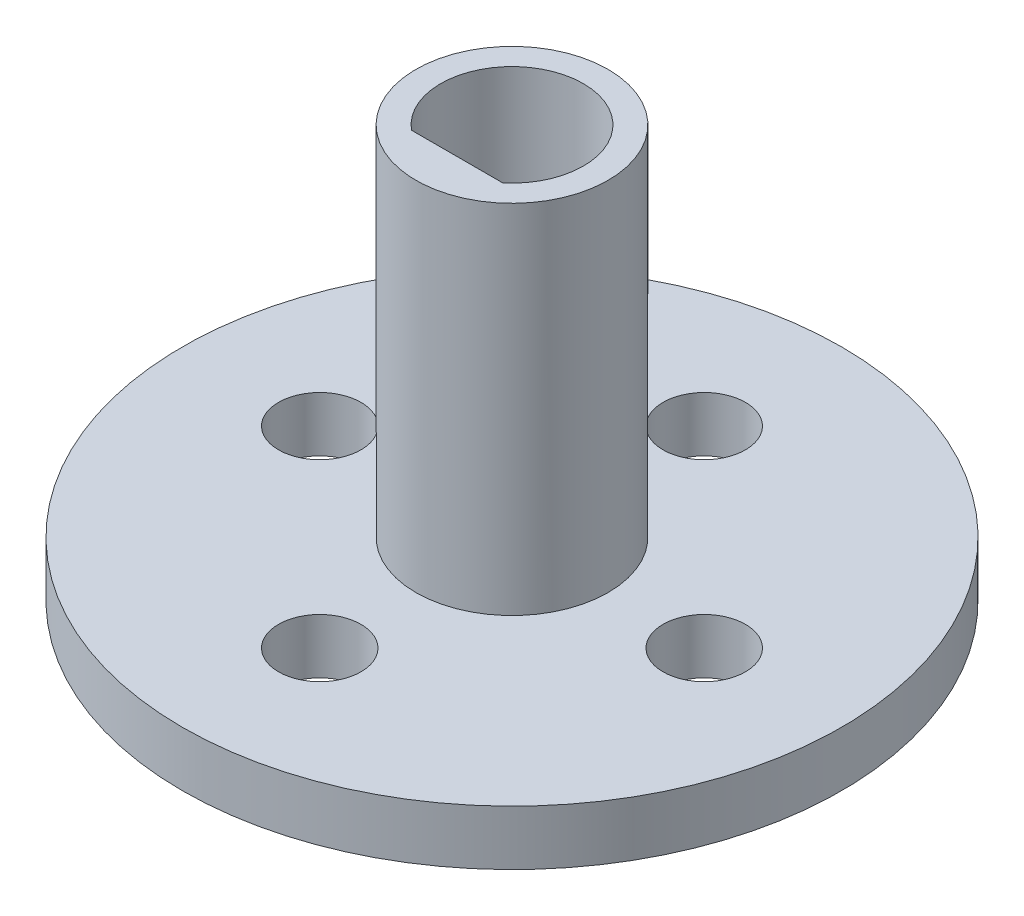
ISO-10303-21;
HEADER;
FILE_DESCRIPTION(('STEP AP214'),'2;1');
FILE_NAME('part.step','',(''),(''),'','','');
FILE_SCHEMA(('AUTOMOTIVE_DESIGN { 1 0 10303 214 1 1 1 1 }'));
ENDSEC;
DATA;
#1=APPLICATION_CONTEXT('core data for automotive mechanical design processes');
#2=APPLICATION_PROTOCOL_DEFINITION('international standard','automotive_design',2000,#1);
#3=PRODUCT_CONTEXT('',#1,'mechanical');
#4=PRODUCT('Part','Part','',(#3));
#5=PRODUCT_RELATED_PRODUCT_CATEGORY('part','',(#4));
#6=PRODUCT_DEFINITION_FORMATION('','',#4);
#7=PRODUCT_DEFINITION_CONTEXT('part definition',#1,'design');
#8=PRODUCT_DEFINITION('design','',#6,#7);
#9=PRODUCT_DEFINITION_SHAPE('','',#8);
#10=(LENGTH_UNIT() NAMED_UNIT(*) SI_UNIT(.MILLI.,.METRE.));
#11=(NAMED_UNIT(*) PLANE_ANGLE_UNIT() SI_UNIT($,.RADIAN.));
#12=(NAMED_UNIT(*) SI_UNIT($,.STERADIAN.) SOLID_ANGLE_UNIT());
#13=UNCERTAINTY_MEASURE_WITH_UNIT(LENGTH_MEASURE(1.E-05),#10,'distance_accuracy_value','');
#14=(GEOMETRIC_REPRESENTATION_CONTEXT(3) GLOBAL_UNCERTAINTY_ASSIGNED_CONTEXT((#13)) GLOBAL_UNIT_ASSIGNED_CONTEXT((#10,
#11,#12)) REPRESENTATION_CONTEXT('',''));
#15=CARTESIAN_POINT('',(0.,0.,0.));
#16=DIRECTION('',(0.,0.,1.));
#17=DIRECTION('',(1.,0.,0.));
#18=AXIS2_PLACEMENT_3D('',#15,#16,#17);
#19=CARTESIAN_POINT('',(0.,2.,0.));
#20=DIRECTION('',(0.,1.,0.));
#21=DIRECTION('',(0.,0.,1.));
#22=AXIS2_PLACEMENT_3D('',#19,#20,#21);
#23=PLANE('',#22);
#24=CARTESIAN_POINT('',(0.,2.,0.));
#25=DIRECTION('',(0.,1.,0.));
#26=DIRECTION('',(0.,0.,1.));
#27=AXIS2_PLACEMENT_3D('',#24,#25,#26);
#28=CIRCLE('',#27,3.5);
#29=CARTESIAN_POINT('',(0.,2.,3.5));
#30=VERTEX_POINT('',#29);
#31=EDGE_CURVE('E11',#30,#30,#28,.T.);
#32=ORIENTED_EDGE('',*,*,#31,.F.);
#33=EDGE_LOOP('',(#32));
#34=FACE_BOUND('',#33,.T.);
#35=CARTESIAN_POINT('',(0.,2.,7.));
#36=DIRECTION('',(0.,1.,0.));
#37=DIRECTION('',(0.,0.,1.));
#38=AXIS2_PLACEMENT_3D('',#35,#36,#37);
#39=CIRCLE('',#38,1.5);
#40=CARTESIAN_POINT('',(0.,2.,8.5));
#41=VERTEX_POINT('',#40);
#42=EDGE_CURVE('E101',#41,#41,#39,.T.);
#43=ORIENTED_EDGE('',*,*,#42,.F.);
#44=EDGE_LOOP('',(#43));
#45=FACE_BOUND('',#44,.T.);
#46=CARTESIAN_POINT('',(0.,2.,-7.));
#47=DIRECTION('',(0.,1.,0.));
#48=DIRECTION('',(0.,0.,1.));
#49=AXIS2_PLACEMENT_3D('',#46,#47,#48);
#50=CIRCLE('',#49,1.5);
#51=CARTESIAN_POINT('',(0.,2.,-5.5));
#52=VERTEX_POINT('',#51);
#53=EDGE_CURVE('E114',#52,#52,#50,.T.);
#54=ORIENTED_EDGE('',*,*,#53,.F.);
#55=EDGE_LOOP('',(#54));
#56=FACE_BOUND('',#55,.T.);
#57=CARTESIAN_POINT('',(0.,2.,0.));
#58=DIRECTION('',(0.,1.,0.));
#59=DIRECTION('',(0.,0.,1.));
#60=AXIS2_PLACEMENT_3D('',#57,#58,#59);
#61=CIRCLE('',#60,12.);
#62=CARTESIAN_POINT('',(0.,2.,12.));
#63=VERTEX_POINT('',#62);
#64=EDGE_CURVE('E55',#63,#63,#61,.T.);
#65=ORIENTED_EDGE('',*,*,#64,.T.);
#66=EDGE_LOOP('',(#65));
#67=FACE_BOUND('',#66,.T.);
#68=CARTESIAN_POINT('',(7.,2.,0.));
#69=DIRECTION('',(0.,1.,0.));
#70=DIRECTION('',(0.,0.,1.));
#71=AXIS2_PLACEMENT_3D('',#68,#69,#70);
#72=CIRCLE('',#71,1.5);
#73=CARTESIAN_POINT('',(7.,2.,1.50000000000002));
#74=VERTEX_POINT('',#73);
#75=EDGE_CURVE('E110',#74,#74,#72,.T.);
#76=ORIENTED_EDGE('',*,*,#75,.F.);
#77=EDGE_LOOP('',(#76));
#78=FACE_BOUND('',#77,.T.);
#79=CARTESIAN_POINT('',(-7.,2.,0.));
#80=DIRECTION('',(0.,1.,0.));
#81=DIRECTION('',(0.,0.,1.));
#82=AXIS2_PLACEMENT_3D('',#79,#80,#81);
#83=CIRCLE('',#82,1.5);
#84=CARTESIAN_POINT('',(-7.,2.,1.49999999999993));
#85=VERTEX_POINT('',#84);
#86=EDGE_CURVE('E92',#85,#85,#83,.T.);
#87=ORIENTED_EDGE('',*,*,#86,.F.);
#88=EDGE_LOOP('',(#87));
#89=FACE_BOUND('',#88,.T.);
#90=ADVANCED_FACE('F43',(#34,#45,#56,#67,#78,#89),#23,.T.);
#91=CARTESIAN_POINT('',(0.,0.,0.));
#92=DIRECTION('',(0.,1.,0.));
#93=DIRECTION('',(0.,0.,1.));
#94=AXIS2_PLACEMENT_3D('',#91,#92,#93);
#95=PLANE('',#94);
#96=DIRECTION('',(1.,0.,0.));
#97=VECTOR('',#96,1.);
#98=CARTESIAN_POINT('',(-1.66132477258361,0.,2.));
#99=LINE('',#98,#97);
#100=CARTESIAN_POINT('',(-1.66132477258361,0.,2.));
#101=VERTEX_POINT('',#100);
#102=CARTESIAN_POINT('',(1.66132477258361,0.,2.));
#103=VERTEX_POINT('',#102);
#104=EDGE_CURVE('E77',#101,#103,#99,.T.);
#105=ORIENTED_EDGE('',*,*,#104,.T.);
#106=CARTESIAN_POINT('',(0.,0.,0.));
#107=DIRECTION('',(0.,1.,0.));
#108=DIRECTION('',(0.,0.,1.));
#109=AXIS2_PLACEMENT_3D('',#106,#107,#108);
#110=CIRCLE('',#109,2.6);
#111=EDGE_CURVE('E73',#103,#101,#110,.T.);
#112=ORIENTED_EDGE('',*,*,#111,.T.);
#113=EDGE_LOOP('',(#105,#112));
#114=FACE_BOUND('',#113,.T.);
#115=CARTESIAN_POINT('',(0.,0.,0.));
#116=DIRECTION('',(0.,1.,0.));
#117=DIRECTION('',(0.,0.,1.));
#118=AXIS2_PLACEMENT_3D('',#115,#116,#117);
#119=CIRCLE('',#118,12.);
#120=CARTESIAN_POINT('',(0.,0.,12.));
#121=VERTEX_POINT('',#120);
#122=EDGE_CURVE('E50',#121,#121,#119,.T.);
#123=ORIENTED_EDGE('',*,*,#122,.F.);
#124=EDGE_LOOP('',(#123));
#125=FACE_BOUND('',#124,.T.);
#126=CARTESIAN_POINT('',(0.,0.,-7.));
#127=DIRECTION('',(0.,1.,0.));
#128=DIRECTION('',(0.,0.,1.));
#129=AXIS2_PLACEMENT_3D('',#126,#127,#128);
#130=CIRCLE('',#129,1.5);
#131=CARTESIAN_POINT('',(0.,0.,-5.5));
#132=VERTEX_POINT('',#131);
#133=EDGE_CURVE('E109',#132,#132,#130,.T.);
#134=ORIENTED_EDGE('',*,*,#133,.T.);
#135=EDGE_LOOP('',(#134));
#136=FACE_BOUND('',#135,.T.);
#137=CARTESIAN_POINT('',(7.,0.,0.));
#138=DIRECTION('',(0.,1.,0.));
#139=DIRECTION('',(0.,0.,1.));
#140=AXIS2_PLACEMENT_3D('',#137,#138,#139);
#141=CIRCLE('',#140,1.5);
#142=CARTESIAN_POINT('',(7.,0.,1.50000000000002));
#143=VERTEX_POINT('',#142);
#144=EDGE_CURVE('E102',#143,#143,#141,.T.);
#145=ORIENTED_EDGE('',*,*,#144,.T.);
#146=EDGE_LOOP('',(#145));
#147=FACE_BOUND('',#146,.T.);
#148=CARTESIAN_POINT('',(0.,0.,7.));
#149=DIRECTION('',(0.,1.,0.));
#150=DIRECTION('',(0.,0.,1.));
#151=AXIS2_PLACEMENT_3D('',#148,#149,#150);
#152=CIRCLE('',#151,1.5);
#153=CARTESIAN_POINT('',(0.,0.,8.5));
#154=VERTEX_POINT('',#153);
#155=EDGE_CURVE('E98',#154,#154,#152,.T.);
#156=ORIENTED_EDGE('',*,*,#155,.T.);
#157=EDGE_LOOP('',(#156));
#158=FACE_BOUND('',#157,.T.);
#159=CARTESIAN_POINT('',(-7.,0.,0.));
#160=DIRECTION('',(0.,1.,0.));
#161=DIRECTION('',(0.,0.,1.));
#162=AXIS2_PLACEMENT_3D('',#159,#160,#161);
#163=CIRCLE('',#162,1.5);
#164=CARTESIAN_POINT('',(-7.,0.,1.49999999999993));
#165=VERTEX_POINT('',#164);
#166=EDGE_CURVE('E91',#165,#165,#163,.T.);
#167=ORIENTED_EDGE('',*,*,#166,.T.);
#168=EDGE_LOOP('',(#167));
#169=FACE_BOUND('',#168,.T.);
#170=ADVANCED_FACE('F83',(#114,#125,#136,#147,#158,#169),#95,.F.);
#171=CARTESIAN_POINT('',(0.,2.,0.));
#172=DIRECTION('',(0.,-1.,0.));
#173=DIRECTION('',(0.,0.,-1.));
#174=AXIS2_PLACEMENT_3D('',#171,#172,#173);
#175=CYLINDRICAL_SURFACE('',#174,12.);
#176=ORIENTED_EDGE('',*,*,#64,.F.);
#177=EDGE_LOOP('',(#176));
#178=FACE_BOUND('',#177,.T.);
#179=ORIENTED_EDGE('',*,*,#122,.T.);
#180=EDGE_LOOP('',(#179));
#181=FACE_BOUND('',#180,.T.);
#182=ADVANCED_FACE('F44',(#178,#181),#175,.T.);
#183=CARTESIAN_POINT('',(0.,2.,-7.));
#184=DIRECTION('',(0.,-1.,0.));
#185=DIRECTION('',(0.,0.,-1.));
#186=AXIS2_PLACEMENT_3D('',#183,#184,#185);
#187=CYLINDRICAL_SURFACE('',#186,1.5);
#188=ORIENTED_EDGE('',*,*,#53,.T.);
#189=EDGE_LOOP('',(#188));
#190=FACE_BOUND('',#189,.T.);
#191=ORIENTED_EDGE('',*,*,#133,.F.);
#192=EDGE_LOOP('',(#191));
#193=FACE_BOUND('',#192,.T.);
#194=ADVANCED_FACE('F160',(#190,#193),#187,.F.);
#195=CARTESIAN_POINT('',(7.,2.,0.));
#196=DIRECTION('',(0.,-1.,0.));
#197=DIRECTION('',(0.,0.,-1.));
#198=AXIS2_PLACEMENT_3D('',#195,#196,#197);
#199=CYLINDRICAL_SURFACE('',#198,1.5);
#200=ORIENTED_EDGE('',*,*,#75,.T.);
#201=EDGE_LOOP('',(#200));
#202=FACE_BOUND('',#201,.T.);
#203=ORIENTED_EDGE('',*,*,#144,.F.);
#204=EDGE_LOOP('',(#203));
#205=FACE_BOUND('',#204,.T.);
#206=ADVANCED_FACE('F150',(#202,#205),#199,.F.);
#207=CARTESIAN_POINT('',(0.,2.,7.));
#208=DIRECTION('',(0.,-1.,0.));
#209=DIRECTION('',(0.,0.,-1.));
#210=AXIS2_PLACEMENT_3D('',#207,#208,#209);
#211=CYLINDRICAL_SURFACE('',#210,1.5);
#212=ORIENTED_EDGE('',*,*,#42,.T.);
#213=EDGE_LOOP('',(#212));
#214=FACE_BOUND('',#213,.T.);
#215=ORIENTED_EDGE('',*,*,#155,.F.);
#216=EDGE_LOOP('',(#215));
#217=FACE_BOUND('',#216,.T.);
#218=ADVANCED_FACE('F136',(#214,#217),#211,.F.);
#219=CARTESIAN_POINT('',(-7.,2.,0.));
#220=DIRECTION('',(0.,-1.,0.));
#221=DIRECTION('',(0.,0.,-1.));
#222=AXIS2_PLACEMENT_3D('',#219,#220,#221);
#223=CYLINDRICAL_SURFACE('',#222,1.5);
#224=ORIENTED_EDGE('',*,*,#86,.T.);
#225=EDGE_LOOP('',(#224));
#226=FACE_BOUND('',#225,.T.);
#227=ORIENTED_EDGE('',*,*,#166,.F.);
#228=EDGE_LOOP('',(#227));
#229=FACE_BOUND('',#228,.T.);
#230=ADVANCED_FACE('F131',(#226,#229),#223,.F.);
#231=CARTESIAN_POINT('',(0.,15.,0.));
#232=DIRECTION('',(0.,-1.,0.));
#233=DIRECTION('',(0.,0.,-1.));
#234=AXIS2_PLACEMENT_3D('',#231,#232,#233);
#235=CYLINDRICAL_SURFACE('',#234,3.5);
#236=ORIENTED_EDGE('',*,*,#31,.T.);
#237=EDGE_LOOP('',(#236));
#238=FACE_BOUND('',#237,.T.);
#239=CARTESIAN_POINT('',(0.,15.,0.));
#240=DIRECTION('',(0.,-1.,0.));
#241=DIRECTION('',(0.,0.,-1.));
#242=AXIS2_PLACEMENT_3D('',#239,#240,#241);
#243=CIRCLE('',#242,3.5);
#244=CARTESIAN_POINT('',(0.,15.,-3.5));
#245=VERTEX_POINT('',#244);
#246=EDGE_CURVE('E76',#245,#245,#243,.T.);
#247=ORIENTED_EDGE('',*,*,#246,.T.);
#248=EDGE_LOOP('',(#247));
#249=FACE_BOUND('',#248,.T.);
#250=ADVANCED_FACE('F132',(#238,#249),#235,.T.);
#251=CARTESIAN_POINT('',(0.,15.,0.));
#252=DIRECTION('',(0.,-1.,0.));
#253=DIRECTION('',(0.,0.,-1.));
#254=AXIS2_PLACEMENT_3D('',#251,#252,#253);
#255=PLANE('',#254);
#256=DIRECTION('',(-1.,0.,0.));
#257=VECTOR('',#256,1.);
#258=CARTESIAN_POINT('',(-1.66132477258361,15.,2.));
#259=LINE('',#258,#257);
#260=CARTESIAN_POINT('',(1.66132477258361,15.,2.));
#261=VERTEX_POINT('',#260);
#262=CARTESIAN_POINT('',(-1.66132477258361,15.,2.));
#263=VERTEX_POINT('',#262);
#264=EDGE_CURVE('E90',#261,#263,#259,.T.);
#265=ORIENTED_EDGE('',*,*,#264,.T.);
#266=CARTESIAN_POINT('',(0.,15.,0.));
#267=DIRECTION('',(0.,-1.,0.));
#268=DIRECTION('',(0.,0.,-1.));
#269=AXIS2_PLACEMENT_3D('',#266,#267,#268);
#270=CIRCLE('',#269,2.6);
#271=EDGE_CURVE('E67',#263,#261,#270,.T.);
#272=ORIENTED_EDGE('',*,*,#271,.T.);
#273=EDGE_LOOP('',(#265,#272));
#274=FACE_BOUND('',#273,.T.);
#275=ORIENTED_EDGE('',*,*,#246,.F.);
#276=EDGE_LOOP('',(#275));
#277=FACE_BOUND('',#276,.T.);
#278=ADVANCED_FACE('F145',(#274,#277),#255,.F.);
#279=CARTESIAN_POINT('',(0.,15.,0.));
#280=DIRECTION('',(0.,-1.,0.));
#281=DIRECTION('',(0.,0.,-1.));
#282=AXIS2_PLACEMENT_3D('',#279,#280,#281);
#283=CYLINDRICAL_SURFACE('',#282,2.6);
#284=DIRECTION('',(0.,-1.,0.));
#285=VECTOR('',#284,1.);
#286=CARTESIAN_POINT('',(-1.66132477258361,15.,2.));
#287=LINE('',#286,#285);
#288=EDGE_CURVE('E75',#263,#101,#287,.T.);
#289=ORIENTED_EDGE('',*,*,#288,.T.);
#290=ORIENTED_EDGE('',*,*,#111,.F.);
#291=DIRECTION('',(0.,-1.,0.));
#292=VECTOR('',#291,1.);
#293=CARTESIAN_POINT('',(1.66132477258361,15.,2.));
#294=LINE('',#293,#292);
#295=EDGE_CURVE('E58',#261,#103,#294,.T.);
#296=ORIENTED_EDGE('',*,*,#295,.F.);
#297=ORIENTED_EDGE('',*,*,#271,.F.);
#298=EDGE_LOOP('',(#289,#290,#296,#297));
#299=FACE_BOUND('',#298,.T.);
#300=ADVANCED_FACE('F71',(#299),#283,.F.);
#301=CARTESIAN_POINT('',(-1.66132477258361,15.,2.));
#302=DIRECTION('',(0.,0.,1.));
#303=DIRECTION('',(1.,0.,0.));
#304=AXIS2_PLACEMENT_3D('',#301,#302,#303);
#305=PLANE('',#304);
#306=ORIENTED_EDGE('',*,*,#295,.T.);
#307=ORIENTED_EDGE('',*,*,#104,.F.);
#308=ORIENTED_EDGE('',*,*,#288,.F.);
#309=ORIENTED_EDGE('',*,*,#264,.F.);
#310=EDGE_LOOP('',(#306,#307,#308,#309));
#311=FACE_BOUND('',#310,.T.);
#312=ADVANCED_FACE('F81',(#311),#305,.F.);
#313=CLOSED_SHELL('',(#90,#170,#182,#194,#206,#218,#230,#250,#278,#300,#312));
#314=MANIFOLD_SOLID_BREP('B2',#313);
#315=ADVANCED_BREP_SHAPE_REPRESENTATION('',(#18,#314),#14);
#316=SHAPE_DEFINITION_REPRESENTATION(#9,#315);
ENDSEC;
END-ISO-10303-21;
